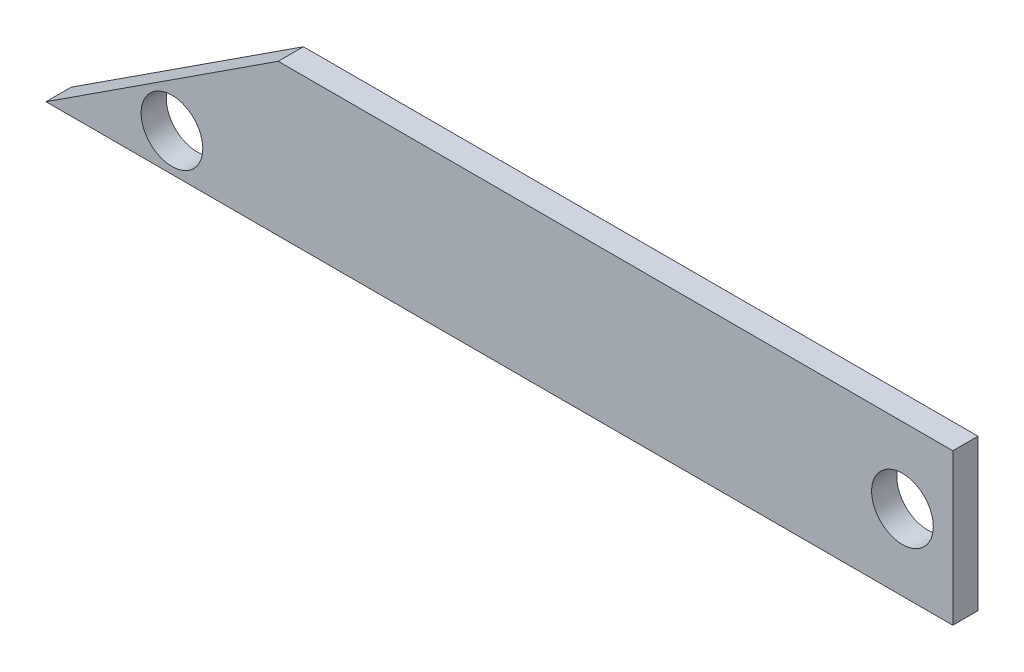
ISO-10303-21;
HEADER;
FILE_DESCRIPTION(('STEP AP214'),'2;1');
FILE_NAME('part.step','',(''),(''),'','','');
FILE_SCHEMA(('AUTOMOTIVE_DESIGN { 1 0 10303 214 1 1 1 1 }'));
ENDSEC;
DATA;
#1=APPLICATION_CONTEXT('core data for automotive mechanical design processes');
#2=APPLICATION_PROTOCOL_DEFINITION('international standard','automotive_design',2000,#1);
#3=PRODUCT_CONTEXT('',#1,'mechanical');
#4=PRODUCT('Part','Part','',(#3));
#5=PRODUCT_RELATED_PRODUCT_CATEGORY('part','',(#4));
#6=PRODUCT_DEFINITION_FORMATION('','',#4);
#7=PRODUCT_DEFINITION_CONTEXT('part definition',#1,'design');
#8=PRODUCT_DEFINITION('design','',#6,#7);
#9=PRODUCT_DEFINITION_SHAPE('','',#8);
#10=(LENGTH_UNIT() NAMED_UNIT(*) SI_UNIT(.MILLI.,.METRE.));
#11=(NAMED_UNIT(*) PLANE_ANGLE_UNIT() SI_UNIT($,.RADIAN.));
#12=(NAMED_UNIT(*) SI_UNIT($,.STERADIAN.) SOLID_ANGLE_UNIT());
#13=UNCERTAINTY_MEASURE_WITH_UNIT(LENGTH_MEASURE(1.E-05),#10,'distance_accuracy_value','');
#14=(GEOMETRIC_REPRESENTATION_CONTEXT(3) GLOBAL_UNCERTAINTY_ASSIGNED_CONTEXT((#13)) GLOBAL_UNIT_ASSIGNED_CONTEXT((#10,
#11,#12)) REPRESENTATION_CONTEXT('',''));
#15=CARTESIAN_POINT('',(0.,0.,0.));
#16=DIRECTION('',(0.,0.,1.));
#17=DIRECTION('',(1.,0.,0.));
#18=AXIS2_PLACEMENT_3D('',#15,#16,#17);
#19=CARTESIAN_POINT('',(0.,0.,12.7));
#20=DIRECTION('',(0.,1.,0.));
#21=DIRECTION('',(0.,0.,1.));
#22=AXIS2_PLACEMENT_3D('',#19,#20,#21);
#23=PLANE('',#22);
#24=DIRECTION('',(1.,0.,0.));
#25=VECTOR('',#24,1.);
#26=CARTESIAN_POINT('',(0.,0.,0.));
#27=LINE('',#26,#25);
#28=CARTESIAN_POINT('',(0.,0.,0.));
#29=VERTEX_POINT('',#28);
#30=CARTESIAN_POINT('',(457.2,0.,0.));
#31=VERTEX_POINT('',#30);
#32=EDGE_CURVE('E78',#29,#31,#27,.T.);
#33=ORIENTED_EDGE('',*,*,#32,.T.);
#34=DIRECTION('',(0.,0.,-1.));
#35=VECTOR('',#34,1.);
#36=CARTESIAN_POINT('',(457.2,0.,12.7));
#37=LINE('',#36,#35);
#38=CARTESIAN_POINT('',(457.2,0.,12.7));
#39=VERTEX_POINT('',#38);
#40=EDGE_CURVE('E39',#39,#31,#37,.T.);
#41=ORIENTED_EDGE('',*,*,#40,.F.);
#42=DIRECTION('',(1.,0.,0.));
#43=VECTOR('',#42,1.);
#44=CARTESIAN_POINT('',(0.,0.,12.7));
#45=LINE('',#44,#43);
#46=CARTESIAN_POINT('',(0.,0.,12.7));
#47=VERTEX_POINT('',#46);
#48=EDGE_CURVE('E87',#47,#39,#45,.T.);
#49=ORIENTED_EDGE('',*,*,#48,.F.);
#50=DIRECTION('',(0.,0.,-1.));
#51=VECTOR('',#50,1.);
#52=CARTESIAN_POINT('',(0.,0.,12.7));
#53=LINE('',#52,#51);
#54=EDGE_CURVE('E11',#47,#29,#53,.T.);
#55=ORIENTED_EDGE('',*,*,#54,.T.);
#56=EDGE_LOOP('',(#33,#41,#49,#55));
#57=FACE_BOUND('',#56,.T.);
#58=ADVANCED_FACE('F32',(#57),#23,.F.);
#59=CARTESIAN_POINT('',(457.2,0.,12.7));
#60=DIRECTION('',(-1.,0.,0.));
#61=DIRECTION('',(0.,0.,1.));
#62=AXIS2_PLACEMENT_3D('',#59,#60,#61);
#63=PLANE('',#62);
#64=DIRECTION('',(0.,1.,0.));
#65=VECTOR('',#64,1.);
#66=CARTESIAN_POINT('',(457.2,0.,0.));
#67=LINE('',#66,#65);
#68=CARTESIAN_POINT('',(457.2,76.2,0.));
#69=VERTEX_POINT('',#68);
#70=EDGE_CURVE('E68',#31,#69,#67,.T.);
#71=ORIENTED_EDGE('',*,*,#70,.T.);
#72=DIRECTION('',(0.,0.,-1.));
#73=VECTOR('',#72,1.);
#74=CARTESIAN_POINT('',(457.2,76.2,12.7));
#75=LINE('',#74,#73);
#76=CARTESIAN_POINT('',(457.2,76.2,12.7));
#77=VERTEX_POINT('',#76);
#78=EDGE_CURVE('E71',#77,#69,#75,.T.);
#79=ORIENTED_EDGE('',*,*,#78,.F.);
#80=DIRECTION('',(0.,1.,0.));
#81=VECTOR('',#80,1.);
#82=CARTESIAN_POINT('',(457.2,0.,12.7));
#83=LINE('',#82,#81);
#84=EDGE_CURVE('E55',#39,#77,#83,.T.);
#85=ORIENTED_EDGE('',*,*,#84,.F.);
#86=ORIENTED_EDGE('',*,*,#40,.T.);
#87=EDGE_LOOP('',(#71,#79,#85,#86));
#88=FACE_BOUND('',#87,.T.);
#89=ADVANCED_FACE('F70',(#88),#63,.F.);
#90=CARTESIAN_POINT('',(0.,76.2,12.7));
#91=DIRECTION('',(0.,-1.,0.));
#92=DIRECTION('',(0.,0.,-1.));
#93=AXIS2_PLACEMENT_3D('',#90,#91,#92);
#94=PLANE('',#93);
#95=DIRECTION('',(-1.,0.,0.));
#96=VECTOR('',#95,1.);
#97=CARTESIAN_POINT('',(0.,76.2,0.));
#98=LINE('',#97,#96);
#99=CARTESIAN_POINT('',(117.08821460762,76.2,0.));
#100=VERTEX_POINT('',#99);
#101=EDGE_CURVE('E77',#69,#100,#98,.T.);
#102=ORIENTED_EDGE('',*,*,#101,.T.);
#103=DIRECTION('',(0.,0.,1.));
#104=VECTOR('',#103,1.);
#105=CARTESIAN_POINT('',(117.08821460762,76.2,0.));
#106=LINE('',#105,#104);
#107=CARTESIAN_POINT('',(117.08821460762,76.2,12.7));
#108=VERTEX_POINT('',#107);
#109=EDGE_CURVE('E46',#100,#108,#106,.T.);
#110=ORIENTED_EDGE('',*,*,#109,.T.);
#111=DIRECTION('',(-1.,0.,0.));
#112=VECTOR('',#111,1.);
#113=CARTESIAN_POINT('',(0.,76.2,12.7));
#114=LINE('',#113,#112);
#115=EDGE_CURVE('E83',#77,#108,#114,.T.);
#116=ORIENTED_EDGE('',*,*,#115,.F.);
#117=ORIENTED_EDGE('',*,*,#78,.T.);
#118=EDGE_LOOP('',(#102,#110,#116,#117));
#119=FACE_BOUND('',#118,.T.);
#120=ADVANCED_FACE('F82',(#119),#94,.F.);
#121=CARTESIAN_POINT('',(0.,0.,12.7));
#122=DIRECTION('',(0.,0.,-1.));
#123=DIRECTION('',(-1.,0.,0.));
#124=AXIS2_PLACEMENT_3D('',#121,#122,#123);
#125=PLANE('',#124);
#126=CARTESIAN_POINT('',(431.8,38.1,12.7));
#127=DIRECTION('',(0.,0.,1.));
#128=DIRECTION('',(1.,0.,0.));
#129=AXIS2_PLACEMENT_3D('',#126,#127,#128);
#130=CIRCLE('',#129,15.5575);
#131=CARTESIAN_POINT('',(447.3575,38.1,12.7));
#132=VERTEX_POINT('',#131);
#133=EDGE_CURVE('E105',#132,#132,#130,.T.);
#134=ORIENTED_EDGE('',*,*,#133,.F.);
#135=EDGE_LOOP('',(#134));
#136=FACE_BOUND('',#135,.T.);
#137=CARTESIAN_POINT('',(63.5,19.05,12.7));
#138=DIRECTION('',(0.,0.,1.));
#139=DIRECTION('',(1.,0.,0.));
#140=AXIS2_PLACEMENT_3D('',#137,#138,#139);
#141=CIRCLE('',#140,15.5575);
#142=CARTESIAN_POINT('',(79.0575,19.05,12.7));
#143=VERTEX_POINT('',#142);
#144=EDGE_CURVE('E99',#143,#143,#141,.T.);
#145=ORIENTED_EDGE('',*,*,#144,.F.);
#146=EDGE_LOOP('',(#145));
#147=FACE_BOUND('',#146,.T.);
#148=ORIENTED_EDGE('',*,*,#115,.T.);
#149=DIRECTION('',(0.838140405208444,0.545454545454546,0.));
#150=VECTOR('',#149,1.);
#151=CARTESIAN_POINT('',(0.,0.,12.7));
#152=LINE('',#151,#150);
#153=EDGE_CURVE('E95',#47,#108,#152,.T.);
#154=ORIENTED_EDGE('',*,*,#153,.F.);
#155=ORIENTED_EDGE('',*,*,#48,.T.);
#156=ORIENTED_EDGE('',*,*,#84,.T.);
#157=EDGE_LOOP('',(#148,#154,#155,#156));
#158=FACE_BOUND('',#157,.T.);
#159=ADVANCED_FACE('F120',(#136,#147,#158),#125,.F.);
#160=CARTESIAN_POINT('',(0.,0.,0.));
#161=DIRECTION('',(0.,0.,-1.));
#162=DIRECTION('',(-1.,0.,0.));
#163=AXIS2_PLACEMENT_3D('',#160,#161,#162);
#164=PLANE('',#163);
#165=CARTESIAN_POINT('',(431.8,38.1,0.));
#166=DIRECTION('',(0.,0.,1.));
#167=DIRECTION('',(1.,0.,0.));
#168=AXIS2_PLACEMENT_3D('',#165,#166,#167);
#169=CIRCLE('',#168,15.5575);
#170=CARTESIAN_POINT('',(447.3575,38.1,0.));
#171=VERTEX_POINT('',#170);
#172=EDGE_CURVE('E102',#171,#171,#169,.T.);
#173=ORIENTED_EDGE('',*,*,#172,.T.);
#174=EDGE_LOOP('',(#173));
#175=FACE_BOUND('',#174,.T.);
#176=CARTESIAN_POINT('',(63.5,19.05,0.));
#177=DIRECTION('',(0.,0.,1.));
#178=DIRECTION('',(1.,0.,0.));
#179=AXIS2_PLACEMENT_3D('',#176,#177,#178);
#180=CIRCLE('',#179,15.5575);
#181=CARTESIAN_POINT('',(79.0575,19.05,0.));
#182=VERTEX_POINT('',#181);
#183=EDGE_CURVE('E97',#182,#182,#180,.T.);
#184=ORIENTED_EDGE('',*,*,#183,.T.);
#185=EDGE_LOOP('',(#184));
#186=FACE_BOUND('',#185,.T.);
#187=DIRECTION('',(0.838140405208444,0.545454545454546,0.));
#188=VECTOR('',#187,1.);
#189=CARTESIAN_POINT('',(0.,0.,0.));
#190=LINE('',#189,#188);
#191=EDGE_CURVE('E86',#29,#100,#190,.T.);
#192=ORIENTED_EDGE('',*,*,#191,.T.);
#193=ORIENTED_EDGE('',*,*,#101,.F.);
#194=ORIENTED_EDGE('',*,*,#70,.F.);
#195=ORIENTED_EDGE('',*,*,#32,.F.);
#196=EDGE_LOOP('',(#192,#193,#194,#195));
#197=FACE_BOUND('',#196,.T.);
#198=ADVANCED_FACE('F85',(#175,#186,#197),#164,.T.);
#199=CARTESIAN_POINT('',(0.,0.,0.));
#200=DIRECTION('',(0.545454545454546,-0.838140405208444,0.));
#201=DIRECTION('',(0.838140405208444,0.545454545454546,0.));
#202=AXIS2_PLACEMENT_3D('',#199,#200,#201);
#203=PLANE('',#202);
#204=ORIENTED_EDGE('',*,*,#153,.T.);
#205=ORIENTED_EDGE('',*,*,#109,.F.);
#206=ORIENTED_EDGE('',*,*,#191,.F.);
#207=ORIENTED_EDGE('',*,*,#54,.F.);
#208=EDGE_LOOP('',(#204,#205,#206,#207));
#209=FACE_BOUND('',#208,.T.);
#210=ADVANCED_FACE('F132',(#209),#203,.F.);
#211=CARTESIAN_POINT('',(63.5,19.05,0.));
#212=DIRECTION('',(0.,0.,1.));
#213=DIRECTION('',(1.,0.,0.));
#214=AXIS2_PLACEMENT_3D('',#211,#212,#213);
#215=CYLINDRICAL_SURFACE('',#214,15.5575);
#216=ORIENTED_EDGE('',*,*,#183,.F.);
#217=EDGE_LOOP('',(#216));
#218=FACE_BOUND('',#217,.T.);
#219=ORIENTED_EDGE('',*,*,#144,.T.);
#220=EDGE_LOOP('',(#219));
#221=FACE_BOUND('',#220,.T.);
#222=ADVANCED_FACE('F116',(#218,#221),#215,.F.);
#223=CARTESIAN_POINT('',(431.8,38.1,0.));
#224=DIRECTION('',(0.,0.,1.));
#225=DIRECTION('',(1.,0.,0.));
#226=AXIS2_PLACEMENT_3D('',#223,#224,#225);
#227=CYLINDRICAL_SURFACE('',#226,15.5575);
#228=ORIENTED_EDGE('',*,*,#172,.F.);
#229=EDGE_LOOP('',(#228));
#230=FACE_BOUND('',#229,.T.);
#231=ORIENTED_EDGE('',*,*,#133,.T.);
#232=EDGE_LOOP('',(#231));
#233=FACE_BOUND('',#232,.T.);
#234=ADVANCED_FACE('F113',(#230,#233),#227,.F.);
#235=CLOSED_SHELL('',(#58,#89,#120,#159,#198,#210,#222,#234));
#236=MANIFOLD_SOLID_BREP('B2',#235);
#237=ADVANCED_BREP_SHAPE_REPRESENTATION('',(#18,#236),#14);
#238=SHAPE_DEFINITION_REPRESENTATION(#9,#237);
ENDSEC;
END-ISO-10303-21;
